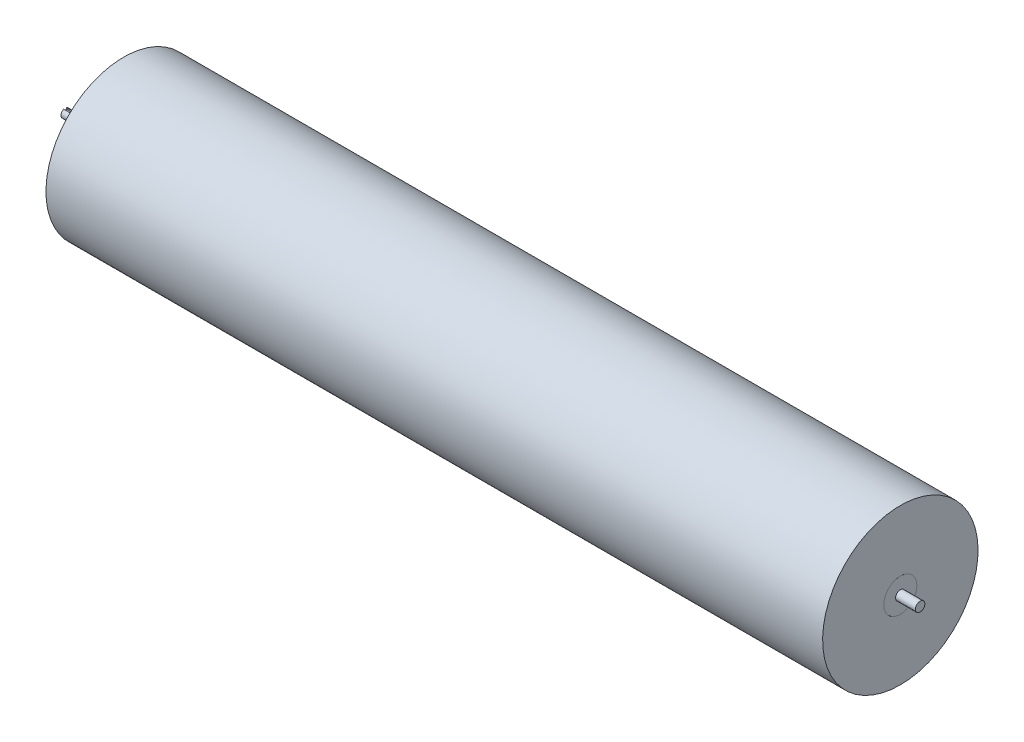
ISO-10303-21;
HEADER;
FILE_DESCRIPTION(('STEP AP214'),'2;1');
FILE_NAME('part.step','',(''),(''),'','','');
FILE_SCHEMA(('AUTOMOTIVE_DESIGN { 1 0 10303 214 1 1 1 1 }'));
ENDSEC;
DATA;
#1=APPLICATION_CONTEXT('core data for automotive mechanical design processes');
#2=APPLICATION_PROTOCOL_DEFINITION('international standard','automotive_design',2000,#1);
#3=PRODUCT_CONTEXT('',#1,'mechanical');
#4=PRODUCT('Part','Part','',(#3));
#5=PRODUCT_RELATED_PRODUCT_CATEGORY('part','',(#4));
#6=PRODUCT_DEFINITION_FORMATION('','',#4);
#7=PRODUCT_DEFINITION_CONTEXT('part definition',#1,'design');
#8=PRODUCT_DEFINITION('design','',#6,#7);
#9=PRODUCT_DEFINITION_SHAPE('','',#8);
#10=(LENGTH_UNIT() NAMED_UNIT(*) SI_UNIT(.MILLI.,.METRE.));
#11=(NAMED_UNIT(*) PLANE_ANGLE_UNIT() SI_UNIT($,.RADIAN.));
#12=(NAMED_UNIT(*) SI_UNIT($,.STERADIAN.) SOLID_ANGLE_UNIT());
#13=UNCERTAINTY_MEASURE_WITH_UNIT(LENGTH_MEASURE(1.E-05),#10,'distance_accuracy_value','');
#14=(GEOMETRIC_REPRESENTATION_CONTEXT(3) GLOBAL_UNCERTAINTY_ASSIGNED_CONTEXT((#13)) GLOBAL_UNIT_ASSIGNED_CONTEXT((#10,
#11,#12)) REPRESENTATION_CONTEXT('',''));
#15=CARTESIAN_POINT('',(0.,0.,0.));
#16=DIRECTION('',(0.,0.,1.));
#17=DIRECTION('',(1.,0.,0.));
#18=AXIS2_PLACEMENT_3D('',#15,#16,#17);
#19=CARTESIAN_POINT('',(-866.5,9.99999999999983,0.));
#20=DIRECTION('',(1.,0.,0.));
#21=DIRECTION('',(0.,1.,0.));
#22=AXIS2_PLACEMENT_3D('',#19,#20,#21);
#23=PLANE('',#22);
#24=CARTESIAN_POINT('',(-866.5,-2.02152447135254E-13,0.));
#25=DIRECTION('',(-1.,0.,0.));
#26=DIRECTION('',(0.,-1.,0.));
#27=AXIS2_PLACEMENT_3D('',#24,#25,#26);
#28=CIRCLE('',#27,9.);
#29=CARTESIAN_POINT('',(-866.5,-9.0000000000002,0.));
#30=VERTEX_POINT('',#29);
#31=EDGE_CURVE('E107',#30,#30,#28,.T.);
#32=ORIENTED_EDGE('',*,*,#31,.F.);
#33=EDGE_LOOP('',(#32));
#34=FACE_BOUND('',#33,.T.);
#35=CARTESIAN_POINT('',(-866.5,-2.02152447135254E-13,0.));
#36=DIRECTION('',(-1.,0.,0.));
#37=DIRECTION('',(0.,-1.,0.));
#38=AXIS2_PLACEMENT_3D('',#35,#36,#37);
#39=CIRCLE('',#38,10.);
#40=CARTESIAN_POINT('',(-866.5,-10.0000000000002,0.));
#41=VERTEX_POINT('',#40);
#42=EDGE_CURVE('E115',#41,#41,#39,.T.);
#43=ORIENTED_EDGE('',*,*,#42,.T.);
#44=EDGE_LOOP('',(#43));
#45=FACE_BOUND('',#44,.T.);
#46=ADVANCED_FACE('F42',(#34,#45),#23,.F.);
#47=CARTESIAN_POINT('',(-948.8,-2.22310133449219E-13,0.));
#48=DIRECTION('',(-1.,0.,0.));
#49=DIRECTION('',(0.,-1.,0.));
#50=AXIS2_PLACEMENT_3D('',#47,#48,#49);
#51=CYLINDRICAL_SURFACE('',#50,10.0000000000001);
#52=ORIENTED_EDGE('',*,*,#42,.F.);
#53=EDGE_LOOP('',(#52));
#54=FACE_BOUND('',#53,.T.);
#55=CARTESIAN_POINT('',(866.5,2.22310133449219E-13,0.));
#56=DIRECTION('',(-1.,0.,0.));
#57=DIRECTION('',(0.,-1.,0.));
#58=AXIS2_PLACEMENT_3D('',#55,#56,#57);
#59=CIRCLE('',#58,10.0000000000002);
#60=CARTESIAN_POINT('',(866.5,-10.,0.));
#61=VERTEX_POINT('',#60);
#62=EDGE_CURVE('E112',#61,#61,#59,.T.);
#63=ORIENTED_EDGE('',*,*,#62,.T.);
#64=EDGE_LOOP('',(#63));
#65=FACE_BOUND('',#64,.T.);
#66=ADVANCED_FACE('F142',(#54,#65),#51,.T.);
#67=CARTESIAN_POINT('',(866.5,10.0000000000004,0.));
#68=DIRECTION('',(-1.,0.,0.));
#69=DIRECTION('',(0.,-1.,0.));
#70=AXIS2_PLACEMENT_3D('',#67,#68,#69);
#71=PLANE('',#70);
#72=ORIENTED_EDGE('',*,*,#62,.F.);
#73=EDGE_LOOP('',(#72));
#74=FACE_BOUND('',#73,.T.);
#75=ADVANCED_FACE('F147',(#74),#71,.F.);
#76=CARTESIAN_POINT('',(-948.8,8.99999999999978,0.));
#77=DIRECTION('',(1.,0.,0.));
#78=DIRECTION('',(0.,1.,0.));
#79=AXIS2_PLACEMENT_3D('',#76,#77,#78);
#80=PLANE('',#79);
#81=DIRECTION('',(0.,0.,1.));
#82=VECTOR('',#81,1.);
#83=CARTESIAN_POINT('',(-948.8,5.49999999999978,3.00000000000001));
#84=LINE('',#83,#82);
#85=CARTESIAN_POINT('',(-948.8,5.49999999999978,-2.99999999999999));
#86=VERTEX_POINT('',#85);
#87=CARTESIAN_POINT('',(-948.8,5.49999999999978,3.00000000000001));
#88=VERTEX_POINT('',#87);
#89=EDGE_CURVE('E88',#86,#88,#84,.T.);
#90=ORIENTED_EDGE('',*,*,#89,.F.);
#91=DIRECTION('',(0.,1.,0.));
#92=VECTOR('',#91,1.);
#93=CARTESIAN_POINT('',(-948.8,5.49999999999978,-2.99999999999999));
#94=LINE('',#93,#92);
#95=CARTESIAN_POINT('',(-948.8,8.48528137423836,-2.99999999999999));
#96=VERTEX_POINT('',#95);
#97=EDGE_CURVE('E110',#86,#96,#94,.T.);
#98=ORIENTED_EDGE('',*,*,#97,.T.);
#99=CARTESIAN_POINT('',(-948.8,-2.22310133449219E-13,0.));
#100=DIRECTION('',(-1.,0.,0.));
#101=DIRECTION('',(0.,-1.,0.));
#102=AXIS2_PLACEMENT_3D('',#99,#100,#101);
#103=CIRCLE('',#102,9.00000000000001);
#104=CARTESIAN_POINT('',(-948.8,8.48528137423835,3.00000000000001));
#105=VERTEX_POINT('',#104);
#106=EDGE_CURVE('E100',#96,#105,#103,.T.);
#107=ORIENTED_EDGE('',*,*,#106,.T.);
#108=DIRECTION('',(0.,1.,0.));
#109=VECTOR('',#108,1.);
#110=CARTESIAN_POINT('',(-948.8,5.49999999999978,3.00000000000001));
#111=LINE('',#110,#109);
#112=EDGE_CURVE('E56',#88,#105,#111,.T.);
#113=ORIENTED_EDGE('',*,*,#112,.F.);
#114=EDGE_LOOP('',(#90,#98,#107,#113));
#115=FACE_BOUND('',#114,.T.);
#116=ADVANCED_FACE('F98',(#115),#80,.F.);
#117=CARTESIAN_POINT('',(-948.8,-2.22310133449219E-13,0.));
#118=DIRECTION('',(-1.,0.,0.));
#119=DIRECTION('',(0.,-1.,0.));
#120=AXIS2_PLACEMENT_3D('',#117,#118,#119);
#121=CYLINDRICAL_SURFACE('',#120,9.);
#122=ORIENTED_EDGE('',*,*,#106,.F.);
#123=DIRECTION('',(-1.,0.,0.));
#124=VECTOR('',#123,1.);
#125=CARTESIAN_POINT('',(-948.8,8.48528137423835,-2.99999999999999));
#126=LINE('',#125,#124);
#127=CARTESIAN_POINT('',(-898.8,8.48528137423837,-2.99999999999999));
#128=VERTEX_POINT('',#127);
#129=EDGE_CURVE('E12',#96,#128,#126,.F.);
#130=ORIENTED_EDGE('',*,*,#129,.T.);
#131=CARTESIAN_POINT('',(-898.8,8.48528137423837,-2.99999999999999));
#132=CARTESIAN_POINT('',(-898.718151506616,8.48526831927768,-3.00001078932486));
#133=CARTESIAN_POINT('',(-898.636310310389,8.48646532685463,-2.996650646659));
#134=CARTESIAN_POINT('',(-898.473262753981,8.49118228945189,-2.98327254936562));
#135=CARTESIAN_POINT('',(-898.392056228414,8.49470161740751,-2.97325639196639));
#136=CARTESIAN_POINT('',(-898.231091413974,8.50395246302989,-2.9466895130735));
#137=CARTESIAN_POINT('',(-898.151329556939,8.50967741820123,-2.93015817315758));
#138=CARTESIAN_POINT('',(-897.993590077701,8.52315143887184,-2.8907301723614));
#139=CARTESIAN_POINT('',(-897.915612520092,8.53090057752378,-2.86783328143236));
#140=CARTESIAN_POINT('',(-897.685246104343,8.55683928952675,-2.78989861567425));
#141=CARTESIAN_POINT('',(-897.536185011037,8.5777349266084,-2.7255770017227));
#142=CARTESIAN_POINT('',(-897.250947826243,8.62436440905008,-2.57421340927521));
#143=CARTESIAN_POINT('',(-897.114779717059,8.65010122261284,-2.48715747922319));
#144=CARTESIAN_POINT('',(-896.85384851584,8.70463418867346,-2.28915595016075));
#145=CARTESIAN_POINT('',(-896.729657828698,8.73350627313624,-2.17747541556626));
#146=CARTESIAN_POINT('',(-896.5013794761,8.79041552071264,-1.93496485428973));
#147=CARTESIAN_POINT('',(-896.397295390344,8.81845253440343,-1.80413142497746));
#148=CARTESIAN_POINT('',(-896.20956213096,8.87141647315449,-1.52281106991361));
#149=CARTESIAN_POINT('',(-896.126517230993,8.89624312238901,-1.37190030336062));
#150=CARTESIAN_POINT('',(-895.987223060795,8.9390882626046,-1.05728771462306));
#151=CARTESIAN_POINT('',(-895.930965605029,8.95710883299462,-0.893589817668203));
#152=CARTESIAN_POINT('',(-895.848792869513,8.98377213313353,-0.564088045228958));
#153=CARTESIAN_POINT('',(-895.821890198608,8.99271926928131,-0.398555505085217));
#154=CARTESIAN_POINT('',(-895.796051088158,9.00130825248989,-0.0650969066623113));
#155=CARTESIAN_POINT('',(-895.797107984901,9.00095231678768,0.102828571763075));
#156=CARTESIAN_POINT('',(-895.826532865931,8.99118115872262,0.429311537734098));
#157=CARTESIAN_POINT('',(-895.853827964006,8.98212182877015,0.587978116884743));
#158=CARTESIAN_POINT('',(-895.933179545892,8.95640881599208,0.898332184121581));
#159=CARTESIAN_POINT('',(-895.985237402705,8.93975471206703,1.05001928471049));
#160=CARTESIAN_POINT('',(-896.113264295135,8.90027004455708,1.34445790368104));
#161=CARTESIAN_POINT('',(-896.189538834144,8.87736112172087,1.48706564697714));
#162=CARTESIAN_POINT('',(-896.363579155205,8.82775164383303,1.7577736372421));
#163=CARTESIAN_POINT('',(-896.461350783324,8.80105005807886,1.88586992347838));
#164=CARTESIAN_POINT('',(-896.681015882458,8.74518810577372,2.13029252762411));
#165=CARTESIAN_POINT('',(-896.803827051325,8.71597116015297,2.2457827740328));
#166=CARTESIAN_POINT('',(-897.067314045293,8.65942491449413,2.45481413464113));
#167=CARTESIAN_POINT('',(-897.207995619293,8.63209622629473,2.54834815783842));
#168=CARTESIAN_POINT('',(-897.506080078237,8.58210018141255,2.712017335544));
#169=CARTESIAN_POINT('',(-897.663699151119,8.55950759277114,2.78178668333581));
#170=CARTESIAN_POINT('',(-897.907684134555,8.53168491329438,2.86551808116449));
#171=CARTESIAN_POINT('',(-897.99025675707,8.52342263559047,2.88993900052903));
#172=CARTESIAN_POINT('',(-898.157370396211,8.50917513666633,2.93162549079292));
#173=CARTESIAN_POINT('',(-898.241910495336,8.50318887578214,2.9488943290211));
#174=CARTESIAN_POINT('',(-898.405233277751,8.49410161473145,2.97496555991274));
#175=CARTESIAN_POINT('',(-898.483912860636,8.49080270505191,2.9843507321819));
#176=CARTESIAN_POINT('',(-898.641725529505,8.48638843638515,2.99686829404165));
#177=CARTESIAN_POINT('',(-898.720857897642,8.48527025982541,3.00000875209309));
#178=CARTESIAN_POINT('',(-898.8,8.48528137423836,2.99999999999999));
#179=B_SPLINE_CURVE_WITH_KNOTS('',3,(#131,#132,#133,#134,#135,#136,#137,#138,#139,#140,#141,
#142,#143,#144,#145,#146,#147,#148,#149,#150,#151,#152,#153,#154,#155,#156,#157,#158,#159,#160,
#161,#162,#163,#164,#165,#166,#167,#168,#169,#170,#171,#172,#173,#174,#175,#176,#177,#178),
.UNSPECIFIED.,.F.,.F.,(4,2,2,2,2,2,2,2,2,2,2,2,2,2,2,2,2,2,2,2,2,2,2,4),(0.,0.245455454206433,
0.490844658508575,0.735509315315106,0.980182815366544,1.46881220307923,1.95774215958644,
2.46393436906079,2.97021661609283,3.48971320817347,4.00905095381429,4.51032334200253,
5.0114762610997,5.49297177415251,5.97449398742789,6.46234978495949,6.95033841784345,
7.46126084192198,7.97234804765762,8.49098011802166,8.75020549988903,9.00931232726973,
9.24695816264709,9.48429674853617),.UNSPECIFIED.);
#180=CARTESIAN_POINT('',(-898.8,8.48528137423835,2.99999999999999));
#181=VERTEX_POINT('',#180);
#182=EDGE_CURVE('E118',#128,#181,#179,.T.);
#183=ORIENTED_EDGE('',*,*,#182,.T.);
#184=DIRECTION('',(-1.,0.,0.));
#185=VECTOR('',#184,1.);
#186=CARTESIAN_POINT('',(-948.8,8.48528137423835,3.00000000000001));
#187=LINE('',#186,#185);
#188=EDGE_CURVE('E49',#181,#105,#187,.T.);
#189=ORIENTED_EDGE('',*,*,#188,.T.);
#190=EDGE_LOOP('',(#122,#130,#183,#189));
#191=FACE_BOUND('',#190,.T.);
#192=ORIENTED_EDGE('',*,*,#31,.T.);
#193=EDGE_LOOP('',(#192));
#194=FACE_BOUND('',#193,.T.);
#195=ADVANCED_FACE('F126',(#191,#194),#121,.T.);
#196=CARTESIAN_POINT('',(-948.8,5.49999999999978,-2.99999999999999));
#197=DIRECTION('',(0.,0.,-1.));
#198=DIRECTION('',(-1.,0.,0.));
#199=AXIS2_PLACEMENT_3D('',#196,#197,#198);
#200=PLANE('',#199);
#201=ORIENTED_EDGE('',*,*,#97,.F.);
#202=DIRECTION('',(-1.,0.,0.));
#203=VECTOR('',#202,1.);
#204=CARTESIAN_POINT('',(-948.8,5.49999999999978,-2.99999999999999));
#205=LINE('',#204,#203);
#206=CARTESIAN_POINT('',(-898.8,5.49999999999979,-2.99999999999999));
#207=VERTEX_POINT('',#206);
#208=EDGE_CURVE('E94',#207,#86,#205,.T.);
#209=ORIENTED_EDGE('',*,*,#208,.F.);
#210=DIRECTION('',(0.,1.,0.));
#211=VECTOR('',#210,1.);
#212=CARTESIAN_POINT('',(-898.8,5.49999999999979,-2.99999999999999));
#213=LINE('',#212,#211);
#214=EDGE_CURVE('E102',#207,#128,#213,.T.);
#215=ORIENTED_EDGE('',*,*,#214,.T.);
#216=ORIENTED_EDGE('',*,*,#129,.F.);
#217=EDGE_LOOP('',(#201,#209,#215,#216));
#218=FACE_BOUND('',#217,.T.);
#219=ADVANCED_FACE('F134',(#218),#200,.F.);
#220=CARTESIAN_POINT('',(-898.8,5.49999999999979,0.));
#221=DIRECTION('',(0.,1.,0.));
#222=DIRECTION('',(-1.,0.,0.));
#223=AXIS2_PLACEMENT_3D('',#220,#221,#222);
#224=CYLINDRICAL_SURFACE('',#223,2.99999999999999);
#225=ORIENTED_EDGE('',*,*,#214,.F.);
#226=CARTESIAN_POINT('',(-898.8,5.49999999999979,0.));
#227=DIRECTION('',(0.,1.,0.));
#228=DIRECTION('',(1.,0.,0.));
#229=AXIS2_PLACEMENT_3D('',#226,#227,#228);
#230=CIRCLE('',#229,2.99999999999999);
#231=CARTESIAN_POINT('',(-898.8,5.49999999999979,2.99999999999999));
#232=VERTEX_POINT('',#231);
#233=EDGE_CURVE('E87',#232,#207,#230,.T.);
#234=ORIENTED_EDGE('',*,*,#233,.F.);
#235=DIRECTION('',(0.,1.,0.));
#236=VECTOR('',#235,1.);
#237=CARTESIAN_POINT('',(-898.8,5.49999999999979,2.99999999999999));
#238=LINE('',#237,#236);
#239=EDGE_CURVE('E83',#232,#181,#238,.T.);
#240=ORIENTED_EDGE('',*,*,#239,.T.);
#241=ORIENTED_EDGE('',*,*,#182,.F.);
#242=EDGE_LOOP('',(#225,#234,#240,#241));
#243=FACE_BOUND('',#242,.T.);
#244=ADVANCED_FACE('F130',(#243),#224,.F.);
#245=CARTESIAN_POINT('',(-898.8,5.49999999999979,2.99999999999999));
#246=DIRECTION('',(0.,0.,1.));
#247=DIRECTION('',(1.,0.,0.));
#248=AXIS2_PLACEMENT_3D('',#245,#246,#247);
#249=PLANE('',#248);
#250=ORIENTED_EDGE('',*,*,#239,.F.);
#251=DIRECTION('',(1.,0.,0.));
#252=VECTOR('',#251,1.);
#253=CARTESIAN_POINT('',(-898.8,5.49999999999979,2.99999999999999));
#254=LINE('',#253,#252);
#255=EDGE_CURVE('E79',#88,#232,#254,.T.);
#256=ORIENTED_EDGE('',*,*,#255,.F.);
#257=ORIENTED_EDGE('',*,*,#112,.T.);
#258=ORIENTED_EDGE('',*,*,#188,.F.);
#259=EDGE_LOOP('',(#250,#256,#257,#258));
#260=FACE_BOUND('',#259,.T.);
#261=ADVANCED_FACE('F81',(#260),#249,.F.);
#262=CARTESIAN_POINT('',(-898.8,5.49999999999979,0.));
#263=DIRECTION('',(0.,-1.,0.));
#264=DIRECTION('',(1.,0.,0.));
#265=AXIS2_PLACEMENT_3D('',#262,#263,#264);
#266=PLANE('',#265);
#267=ORIENTED_EDGE('',*,*,#89,.T.);
#268=ORIENTED_EDGE('',*,*,#255,.T.);
#269=ORIENTED_EDGE('',*,*,#233,.T.);
#270=ORIENTED_EDGE('',*,*,#208,.T.);
#271=EDGE_LOOP('',(#267,#268,#269,#270));
#272=FACE_BOUND('',#271,.T.);
#273=ADVANCED_FACE('F92',(#272),#266,.F.);
#274=CLOSED_SHELL('',(#46,#66,#75,#116,#195,#219,#244,#261,#273));
#275=MANIFOLD_SOLID_BREP('B2',#274);
#276=CARTESIAN_POINT('',(814.5,2.07678697362758E-13,0.));
#277=DIRECTION('',(1.,0.,0.));
#278=DIRECTION('',(0.,1.,0.));
#279=AXIS2_PLACEMENT_3D('',#276,#277,#278);
#280=CYLINDRICAL_SURFACE('',#279,35.1);
#281=CARTESIAN_POINT('',(814.5,2.07678697362758E-13,0.));
#282=DIRECTION('',(1.,0.,0.));
#283=DIRECTION('',(0.,1.,0.));
#284=AXIS2_PLACEMENT_3D('',#281,#282,#283);
#285=CIRCLE('',#284,35.1);
#286=CARTESIAN_POINT('',(814.5,35.1000000000002,0.));
#287=VERTEX_POINT('',#286);
#288=EDGE_CURVE('E41',#287,#287,#285,.T.);
#289=ORIENTED_EDGE('',*,*,#288,.T.);
#290=EDGE_LOOP('',(#289));
#291=FACE_BOUND('',#290,.T.);
#292=CARTESIAN_POINT('',(824.5,2.09626294381453E-13,0.));
#293=DIRECTION('',(1.,0.,0.));
#294=DIRECTION('',(0.,1.,0.));
#295=AXIS2_PLACEMENT_3D('',#292,#293,#294);
#296=CIRCLE('',#295,35.1);
#297=CARTESIAN_POINT('',(824.5,35.1000000000002,0.));
#298=VERTEX_POINT('',#297);
#299=EDGE_CURVE('E228',#298,#298,#296,.T.);
#300=ORIENTED_EDGE('',*,*,#299,.F.);
#301=EDGE_LOOP('',(#300));
#302=FACE_BOUND('',#301,.T.);
#303=ADVANCED_FACE('F225',(#291,#302),#280,.T.);
#304=CARTESIAN_POINT('',(814.5,2.07678697362758E-13,0.));
#305=DIRECTION('',(1.,0.,0.));
#306=DIRECTION('',(0.,1.,0.));
#307=AXIS2_PLACEMENT_3D('',#304,#305,#306);
#308=PLANE('',#307);
#309=CARTESIAN_POINT('',(814.5,2.07678697362758E-13,0.));
#310=DIRECTION('',(1.,0.,0.));
#311=DIRECTION('',(0.,1.,0.));
#312=AXIS2_PLACEMENT_3D('',#309,#310,#311);
#313=CIRCLE('',#312,10.0005);
#314=CARTESIAN_POINT('',(814.5,10.0005000000002,0.));
#315=VERTEX_POINT('',#314);
#316=EDGE_CURVE('E235',#315,#315,#313,.T.);
#317=ORIENTED_EDGE('',*,*,#316,.T.);
#318=EDGE_LOOP('',(#317));
#319=FACE_BOUND('',#318,.T.);
#320=ORIENTED_EDGE('',*,*,#288,.F.);
#321=EDGE_LOOP('',(#320));
#322=FACE_BOUND('',#321,.T.);
#323=ADVANCED_FACE('F243',(#319,#322),#308,.F.);
#324=CARTESIAN_POINT('',(824.5,2.09626294381453E-13,0.));
#325=DIRECTION('',(1.,0.,0.));
#326=DIRECTION('',(0.,1.,0.));
#327=AXIS2_PLACEMENT_3D('',#324,#325,#326);
#328=PLANE('',#327);
#329=CARTESIAN_POINT('',(824.5,2.09626294381453E-13,0.));
#330=DIRECTION('',(1.,0.,0.));
#331=DIRECTION('',(0.,1.,0.));
#332=AXIS2_PLACEMENT_3D('',#329,#330,#331);
#333=CIRCLE('',#332,10.0005);
#334=CARTESIAN_POINT('',(824.5,10.0005000000002,0.));
#335=VERTEX_POINT('',#334);
#336=EDGE_CURVE('E237',#335,#335,#333,.T.);
#337=ORIENTED_EDGE('',*,*,#336,.F.);
#338=EDGE_LOOP('',(#337));
#339=FACE_BOUND('',#338,.T.);
#340=ORIENTED_EDGE('',*,*,#299,.T.);
#341=EDGE_LOOP('',(#340));
#342=FACE_BOUND('',#341,.T.);
#343=ADVANCED_FACE('F249',(#339,#342),#328,.T.);
#344=CARTESIAN_POINT('',(814.5,2.07678697362758E-13,0.));
#345=DIRECTION('',(1.,0.,0.));
#346=DIRECTION('',(0.,1.,0.));
#347=AXIS2_PLACEMENT_3D('',#344,#345,#346);
#348=CYLINDRICAL_SURFACE('',#347,10.0005);
#349=ORIENTED_EDGE('',*,*,#316,.F.);
#350=EDGE_LOOP('',(#349));
#351=FACE_BOUND('',#350,.T.);
#352=ORIENTED_EDGE('',*,*,#336,.T.);
#353=EDGE_LOOP('',(#352));
#354=FACE_BOUND('',#353,.T.);
#355=ADVANCED_FACE('F246',(#351,#354),#348,.F.);
#356=CLOSED_SHELL('',(#303,#323,#343,#355));
#357=MANIFOLD_SOLID_BREP('B6',#356);
#358=CARTESIAN_POINT('',(-814.5,-1.09584856982612E-13,0.));
#359=DIRECTION('',(-1.,0.,0.));
#360=DIRECTION('',(0.,-1.,0.));
#361=AXIS2_PLACEMENT_3D('',#358,#359,#360);
#362=CYLINDRICAL_SURFACE('',#361,35.1);
#363=CARTESIAN_POINT('',(-814.5,-1.09584856982612E-13,0.));
#364=DIRECTION('',(-1.,0.,0.));
#365=DIRECTION('',(0.,-1.,0.));
#366=AXIS2_PLACEMENT_3D('',#363,#364,#365);
#367=CIRCLE('',#366,35.1);
#368=CARTESIAN_POINT('',(-814.5,-35.1000000000001,0.));
#369=VERTEX_POINT('',#368);
#370=EDGE_CURVE('E224',#369,#369,#367,.T.);
#371=ORIENTED_EDGE('',*,*,#370,.T.);
#372=EDGE_LOOP('',(#371));
#373=FACE_BOUND('',#372,.T.);
#374=CARTESIAN_POINT('',(-824.5,-1.11532454001307E-13,0.));
#375=DIRECTION('',(-1.,0.,0.));
#376=DIRECTION('',(0.,-1.,0.));
#377=AXIS2_PLACEMENT_3D('',#374,#375,#376);
#378=CIRCLE('',#377,35.1);
#379=CARTESIAN_POINT('',(-824.5,-35.1000000000001,0.));
#380=VERTEX_POINT('',#379);
#381=EDGE_CURVE('E297',#380,#380,#378,.T.);
#382=ORIENTED_EDGE('',*,*,#381,.F.);
#383=EDGE_LOOP('',(#382));
#384=FACE_BOUND('',#383,.T.);
#385=ADVANCED_FACE('F294',(#373,#384),#362,.T.);
#386=CARTESIAN_POINT('',(-814.5,-1.09584856982612E-13,0.));
#387=DIRECTION('',(-1.,0.,0.));
#388=DIRECTION('',(0.,-1.,0.));
#389=AXIS2_PLACEMENT_3D('',#386,#387,#388);
#390=PLANE('',#389);
#391=CARTESIAN_POINT('',(-814.5,-1.09584856982612E-13,0.));
#392=DIRECTION('',(-1.,0.,0.));
#393=DIRECTION('',(0.,-1.,0.));
#394=AXIS2_PLACEMENT_3D('',#391,#392,#393);
#395=CIRCLE('',#394,10.0005);
#396=CARTESIAN_POINT('',(-814.5,-10.0005000000001,0.));
#397=VERTEX_POINT('',#396);
#398=EDGE_CURVE('E304',#397,#397,#395,.T.);
#399=ORIENTED_EDGE('',*,*,#398,.T.);
#400=EDGE_LOOP('',(#399));
#401=FACE_BOUND('',#400,.T.);
#402=ORIENTED_EDGE('',*,*,#370,.F.);
#403=EDGE_LOOP('',(#402));
#404=FACE_BOUND('',#403,.T.);
#405=ADVANCED_FACE('F312',(#401,#404),#390,.F.);
#406=CARTESIAN_POINT('',(-824.5,-1.11532454001307E-13,0.));
#407=DIRECTION('',(-1.,0.,0.));
#408=DIRECTION('',(0.,-1.,0.));
#409=AXIS2_PLACEMENT_3D('',#406,#407,#408);
#410=PLANE('',#409);
#411=CARTESIAN_POINT('',(-824.5,-1.11532454001307E-13,0.));
#412=DIRECTION('',(-1.,0.,0.));
#413=DIRECTION('',(0.,-1.,0.));
#414=AXIS2_PLACEMENT_3D('',#411,#412,#413);
#415=CIRCLE('',#414,10.0005);
#416=CARTESIAN_POINT('',(-824.5,-10.0005000000001,0.));
#417=VERTEX_POINT('',#416);
#418=EDGE_CURVE('E306',#417,#417,#415,.T.);
#419=ORIENTED_EDGE('',*,*,#418,.F.);
#420=EDGE_LOOP('',(#419));
#421=FACE_BOUND('',#420,.T.);
#422=ORIENTED_EDGE('',*,*,#381,.T.);
#423=EDGE_LOOP('',(#422));
#424=FACE_BOUND('',#423,.T.);
#425=ADVANCED_FACE('F318',(#421,#424),#410,.T.);
#426=CARTESIAN_POINT('',(-814.5,-1.09584856982612E-13,0.));
#427=DIRECTION('',(-1.,0.,0.));
#428=DIRECTION('',(0.,-1.,0.));
#429=AXIS2_PLACEMENT_3D('',#426,#427,#428);
#430=CYLINDRICAL_SURFACE('',#429,10.0005);
#431=ORIENTED_EDGE('',*,*,#398,.F.);
#432=EDGE_LOOP('',(#431));
#433=FACE_BOUND('',#432,.T.);
#434=ORIENTED_EDGE('',*,*,#418,.T.);
#435=EDGE_LOOP('',(#434));
#436=FACE_BOUND('',#435,.T.);
#437=ADVANCED_FACE('F315',(#433,#436),#430,.F.);
#438=CLOSED_SHELL('',(#385,#405,#425,#437));
#439=MANIFOLD_SOLID_BREP('B36',#438);
#440=CARTESIAN_POINT('',(-824.5,35.1004999999998,0.));
#441=DIRECTION('',(1.,0.,0.));
#442=DIRECTION('',(0.,1.,0.));
#443=AXIS2_PLACEMENT_3D('',#440,#441,#442);
#444=PLANE('',#443);
#445=CARTESIAN_POINT('',(-824.5,0.,0.));
#446=DIRECTION('',(-1.,0.,0.));
#447=DIRECTION('',(0.,-1.,0.));
#448=AXIS2_PLACEMENT_3D('',#445,#446,#447);
#449=CIRCLE('',#448,35.1004999999998);
#450=CARTESIAN_POINT('',(-824.5,-35.1004999999998,0.));
#451=VERTEX_POINT('',#450);
#452=EDGE_CURVE('E370',#451,#451,#449,.T.);
#453=ORIENTED_EDGE('',*,*,#452,.F.);
#454=EDGE_LOOP('',(#453));
#455=FACE_BOUND('',#454,.T.);
#456=CARTESIAN_POINT('',(-824.5,0.,0.));
#457=DIRECTION('',(-1.,0.,0.));
#458=DIRECTION('',(0.,-1.,0.));
#459=AXIS2_PLACEMENT_3D('',#456,#457,#458);
#460=CIRCLE('',#459,165.);
#461=CARTESIAN_POINT('',(-824.5,-165.,0.));
#462=VERTEX_POINT('',#461);
#463=EDGE_CURVE('E293',#462,#462,#460,.T.);
#464=ORIENTED_EDGE('',*,*,#463,.T.);
#465=EDGE_LOOP('',(#464));
#466=FACE_BOUND('',#465,.T.);
#467=ADVANCED_FACE('F356',(#455,#466),#444,.F.);
#468=CARTESIAN_POINT('',(-824.5,0.,0.));
#469=DIRECTION('',(-1.,0.,0.));
#470=DIRECTION('',(0.,-1.,0.));
#471=AXIS2_PLACEMENT_3D('',#468,#469,#470);
#472=CYLINDRICAL_SURFACE('',#471,165.);
#473=ORIENTED_EDGE('',*,*,#463,.F.);
#474=EDGE_LOOP('',(#473));
#475=FACE_BOUND('',#474,.T.);
#476=CARTESIAN_POINT('',(824.5,3.02916385769098E-13,0.));
#477=DIRECTION('',(-1.,0.,0.));
#478=DIRECTION('',(0.,-1.,0.));
#479=AXIS2_PLACEMENT_3D('',#476,#477,#478);
#480=CIRCLE('',#479,165.);
#481=CARTESIAN_POINT('',(824.5,-165.,0.));
#482=VERTEX_POINT('',#481);
#483=EDGE_CURVE('E362',#482,#482,#480,.T.);
#484=ORIENTED_EDGE('',*,*,#483,.T.);
#485=EDGE_LOOP('',(#484));
#486=FACE_BOUND('',#485,.T.);
#487=ADVANCED_FACE('F379',(#475,#486),#472,.T.);
#488=CARTESIAN_POINT('',(824.5,165.,0.));
#489=DIRECTION('',(-1.,0.,0.));
#490=DIRECTION('',(0.,-1.,0.));
#491=AXIS2_PLACEMENT_3D('',#488,#489,#490);
#492=PLANE('',#491);
#493=ORIENTED_EDGE('',*,*,#483,.F.);
#494=EDGE_LOOP('',(#493));
#495=FACE_BOUND('',#494,.T.);
#496=CARTESIAN_POINT('',(824.5,3.02916385769098E-13,0.));
#497=DIRECTION('',(-1.,0.,0.));
#498=DIRECTION('',(0.,-1.,0.));
#499=AXIS2_PLACEMENT_3D('',#496,#497,#498);
#500=CIRCLE('',#499,35.1004999999998);
#501=CARTESIAN_POINT('',(824.5,-35.1004999999995,0.));
#502=VERTEX_POINT('',#501);
#503=EDGE_CURVE('E366',#502,#502,#500,.T.);
#504=ORIENTED_EDGE('',*,*,#503,.T.);
#505=EDGE_LOOP('',(#504));
#506=FACE_BOUND('',#505,.T.);
#507=ADVANCED_FACE('F383',(#495,#506),#492,.F.);
#508=CARTESIAN_POINT('',(-824.5,0.,0.));
#509=DIRECTION('',(-1.,0.,0.));
#510=DIRECTION('',(0.,-1.,0.));
#511=AXIS2_PLACEMENT_3D('',#508,#509,#510);
#512=CYLINDRICAL_SURFACE('',#511,35.1004999999998);
#513=ORIENTED_EDGE('',*,*,#503,.F.);
#514=EDGE_LOOP('',(#513));
#515=FACE_BOUND('',#514,.T.);
#516=ORIENTED_EDGE('',*,*,#452,.T.);
#517=EDGE_LOOP('',(#516));
#518=FACE_BOUND('',#517,.T.);
#519=ADVANCED_FACE('F376',(#515,#518),#512,.F.);
#520=CLOSED_SHELL('',(#467,#487,#507,#519));
#521=MANIFOLD_SOLID_BREP('B219',#520);
#522=ADVANCED_BREP_SHAPE_REPRESENTATION('',(#18,#275,#357,#439,#521),#14);
#523=SHAPE_DEFINITION_REPRESENTATION(#9,#522);
ENDSEC;
END-ISO-10303-21;
